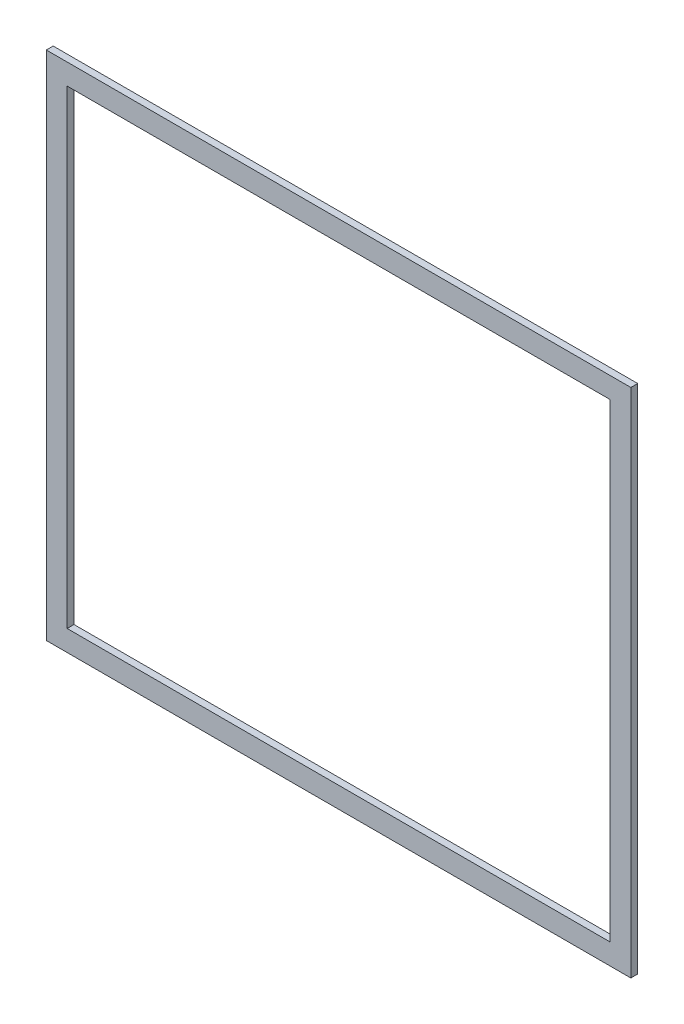
ISO-10303-21;
HEADER;
FILE_DESCRIPTION(('STEP AP214'),'2;1');
FILE_NAME('part.step','',(''),(''),'','','');
FILE_SCHEMA(('AUTOMOTIVE_DESIGN { 1 0 10303 214 1 1 1 1 }'));
ENDSEC;
DATA;
#1=APPLICATION_CONTEXT('core data for automotive mechanical design processes');
#2=APPLICATION_PROTOCOL_DEFINITION('international standard','automotive_design',2000,#1);
#3=PRODUCT_CONTEXT('',#1,'mechanical');
#4=PRODUCT('Part','Part','',(#3));
#5=PRODUCT_RELATED_PRODUCT_CATEGORY('part','',(#4));
#6=PRODUCT_DEFINITION_FORMATION('','',#4);
#7=PRODUCT_DEFINITION_CONTEXT('part definition',#1,'design');
#8=PRODUCT_DEFINITION('design','',#6,#7);
#9=PRODUCT_DEFINITION_SHAPE('','',#8);
#10=(LENGTH_UNIT() NAMED_UNIT(*) SI_UNIT(.MILLI.,.METRE.));
#11=(NAMED_UNIT(*) PLANE_ANGLE_UNIT() SI_UNIT($,.RADIAN.));
#12=(NAMED_UNIT(*) SI_UNIT($,.STERADIAN.) SOLID_ANGLE_UNIT());
#13=UNCERTAINTY_MEASURE_WITH_UNIT(LENGTH_MEASURE(1.E-05),#10,'distance_accuracy_value','');
#14=(GEOMETRIC_REPRESENTATION_CONTEXT(3) GLOBAL_UNCERTAINTY_ASSIGNED_CONTEXT((#13)) GLOBAL_UNIT_ASSIGNED_CONTEXT((#10,
#11,#12)) REPRESENTATION_CONTEXT('',''));
#15=CARTESIAN_POINT('',(0.,0.,0.));
#16=DIRECTION('',(0.,0.,1.));
#17=DIRECTION('',(1.,0.,0.));
#18=AXIS2_PLACEMENT_3D('',#15,#16,#17);
#19=CARTESIAN_POINT('',(94.2975,-81.5975,0.));
#20=DIRECTION('',(1.,0.,0.));
#21=DIRECTION('',(0.,1.,0.));
#22=AXIS2_PLACEMENT_3D('',#19,#20,#21);
#23=PLANE('',#22);
#24=DIRECTION('',(0.,0.,1.));
#25=VECTOR('',#24,1.);
#26=CARTESIAN_POINT('',(94.2975,81.5975000000001,0.));
#27=LINE('',#26,#25);
#28=CARTESIAN_POINT('',(94.2975,81.5975000000001,0.));
#29=VERTEX_POINT('',#28);
#30=CARTESIAN_POINT('',(94.2975,81.5975000000001,2.3876));
#31=VERTEX_POINT('',#30);
#32=EDGE_CURVE('E12',#29,#31,#27,.T.);
#33=ORIENTED_EDGE('',*,*,#32,.F.);
#34=DIRECTION('',(0.,1.,0.));
#35=VECTOR('',#34,1.);
#36=CARTESIAN_POINT('',(94.2975,-81.5975,0.));
#37=LINE('',#36,#35);
#38=CARTESIAN_POINT('',(94.2975,-81.5975,0.));
#39=VERTEX_POINT('',#38);
#40=EDGE_CURVE('E159',#39,#29,#37,.T.);
#41=ORIENTED_EDGE('',*,*,#40,.F.);
#42=DIRECTION('',(0.,0.,-1.));
#43=VECTOR('',#42,1.);
#44=CARTESIAN_POINT('',(94.2975,-81.5975,0.));
#45=LINE('',#44,#43);
#46=CARTESIAN_POINT('',(94.2975,-81.5975,2.3876));
#47=VERTEX_POINT('',#46);
#48=EDGE_CURVE('E169',#47,#39,#45,.T.);
#49=ORIENTED_EDGE('',*,*,#48,.F.);
#50=DIRECTION('',(0.,1.,0.));
#51=VECTOR('',#50,1.);
#52=CARTESIAN_POINT('',(94.2975,-81.5975,2.3876));
#53=LINE('',#52,#51);
#54=EDGE_CURVE('E153',#47,#31,#53,.T.);
#55=ORIENTED_EDGE('',*,*,#54,.T.);
#56=EDGE_LOOP('',(#33,#41,#49,#55));
#57=FACE_BOUND('',#56,.T.);
#58=ADVANCED_FACE('F40',(#57),#23,.F.);
#59=CARTESIAN_POINT('',(101.5365,-88.8365,2.3876));
#60=DIRECTION('',(-1.,0.,0.));
#61=DIRECTION('',(0.,-1.,0.));
#62=AXIS2_PLACEMENT_3D('',#59,#60,#61);
#63=PLANE('',#62);
#64=DIRECTION('',(0.,0.,-1.));
#65=VECTOR('',#64,1.);
#66=CARTESIAN_POINT('',(101.5365,88.8365,2.3876));
#67=LINE('',#66,#65);
#68=CARTESIAN_POINT('',(101.5365,88.8365000000001,2.3876));
#69=VERTEX_POINT('',#68);
#70=CARTESIAN_POINT('',(101.5365,88.8365,0.));
#71=VERTEX_POINT('',#70);
#72=EDGE_CURVE('E50',#69,#71,#67,.T.);
#73=ORIENTED_EDGE('',*,*,#72,.F.);
#74=DIRECTION('',(0.,1.,0.));
#75=VECTOR('',#74,1.);
#76=CARTESIAN_POINT('',(101.5365,-88.8365,2.3876));
#77=LINE('',#76,#75);
#78=CARTESIAN_POINT('',(101.5365,-88.8365,2.3876));
#79=VERTEX_POINT('',#78);
#80=EDGE_CURVE('E158',#79,#69,#77,.T.);
#81=ORIENTED_EDGE('',*,*,#80,.F.);
#82=DIRECTION('',(0.,0.,1.));
#83=VECTOR('',#82,1.);
#84=CARTESIAN_POINT('',(101.5365,-88.8365,2.3876));
#85=LINE('',#84,#83);
#86=CARTESIAN_POINT('',(101.5365,-88.8365,0.));
#87=VERTEX_POINT('',#86);
#88=EDGE_CURVE('E156',#87,#79,#85,.T.);
#89=ORIENTED_EDGE('',*,*,#88,.F.);
#90=DIRECTION('',(0.,1.,0.));
#91=VECTOR('',#90,1.);
#92=CARTESIAN_POINT('',(101.5365,-88.8365,0.));
#93=LINE('',#92,#91);
#94=EDGE_CURVE('E145',#87,#71,#93,.T.);
#95=ORIENTED_EDGE('',*,*,#94,.T.);
#96=EDGE_LOOP('',(#73,#81,#89,#95));
#97=FACE_BOUND('',#96,.T.);
#98=ADVANCED_FACE('F42',(#97),#63,.F.);
#99=CARTESIAN_POINT('',(-101.5365,-88.8365,2.3876));
#100=DIRECTION('',(0.,-1.,0.));
#101=DIRECTION('',(0.,0.,-1.));
#102=AXIS2_PLACEMENT_3D('',#99,#100,#101);
#103=PLANE('',#102);
#104=DIRECTION('',(1.,0.,0.));
#105=VECTOR('',#104,1.);
#106=CARTESIAN_POINT('',(-101.5365,-88.8365,0.));
#107=LINE('',#106,#105);
#108=CARTESIAN_POINT('',(-101.5365,-88.8365,0.));
#109=VERTEX_POINT('',#108);
#110=EDGE_CURVE('E179',#109,#87,#107,.T.);
#111=ORIENTED_EDGE('',*,*,#110,.T.);
#112=ORIENTED_EDGE('',*,*,#88,.T.);
#113=DIRECTION('',(1.,0.,0.));
#114=VECTOR('',#113,1.);
#115=CARTESIAN_POINT('',(-101.5365,-88.8365,2.3876));
#116=LINE('',#115,#114);
#117=CARTESIAN_POINT('',(-101.5365,-88.8365,2.3876));
#118=VERTEX_POINT('',#117);
#119=EDGE_CURVE('E175',#118,#79,#116,.T.);
#120=ORIENTED_EDGE('',*,*,#119,.F.);
#121=DIRECTION('',(0.,0.,-1.));
#122=VECTOR('',#121,1.);
#123=CARTESIAN_POINT('',(-101.5365,-88.8365,2.3876));
#124=LINE('',#123,#122);
#125=EDGE_CURVE('E184',#118,#109,#124,.T.);
#126=ORIENTED_EDGE('',*,*,#125,.T.);
#127=EDGE_LOOP('',(#111,#112,#120,#126));
#128=FACE_BOUND('',#127,.T.);
#129=ADVANCED_FACE('F193',(#128),#103,.T.);
#130=CARTESIAN_POINT('',(-94.2974999999999,-81.5975,0.));
#131=DIRECTION('',(0.,1.,0.));
#132=DIRECTION('',(0.,0.,1.));
#133=AXIS2_PLACEMENT_3D('',#130,#131,#132);
#134=PLANE('',#133);
#135=DIRECTION('',(1.,0.,0.));
#136=VECTOR('',#135,1.);
#137=CARTESIAN_POINT('',(-94.2974999999999,-81.5975,2.3876));
#138=LINE('',#137,#136);
#139=CARTESIAN_POINT('',(-94.2974999999999,-81.5975,2.3876));
#140=VERTEX_POINT('',#139);
#141=EDGE_CURVE('E111',#140,#47,#138,.T.);
#142=ORIENTED_EDGE('',*,*,#141,.T.);
#143=ORIENTED_EDGE('',*,*,#48,.T.);
#144=DIRECTION('',(1.,0.,0.));
#145=VECTOR('',#144,1.);
#146=CARTESIAN_POINT('',(-94.2974999999999,-81.5975,0.));
#147=LINE('',#146,#145);
#148=CARTESIAN_POINT('',(-94.2974999999999,-81.5975,0.));
#149=VERTEX_POINT('',#148);
#150=EDGE_CURVE('E172',#149,#39,#147,.T.);
#151=ORIENTED_EDGE('',*,*,#150,.F.);
#152=DIRECTION('',(0.,0.,1.));
#153=VECTOR('',#152,1.);
#154=CARTESIAN_POINT('',(-94.2974999999999,-81.5975,0.));
#155=LINE('',#154,#153);
#156=EDGE_CURVE('E174',#149,#140,#155,.T.);
#157=ORIENTED_EDGE('',*,*,#156,.T.);
#158=EDGE_LOOP('',(#142,#143,#151,#157));
#159=FACE_BOUND('',#158,.T.);
#160=ADVANCED_FACE('F173',(#159),#134,.T.);
#161=CARTESIAN_POINT('',(-101.5365,88.8365,2.3876));
#162=DIRECTION('',(1.,0.,0.));
#163=DIRECTION('',(0.,1.,0.));
#164=AXIS2_PLACEMENT_3D('',#161,#162,#163);
#165=PLANE('',#164);
#166=ORIENTED_EDGE('',*,*,#125,.F.);
#167=DIRECTION('',(0.,-1.,0.));
#168=VECTOR('',#167,1.);
#169=CARTESIAN_POINT('',(-101.5365,88.8365,2.3876));
#170=LINE('',#169,#168);
#171=CARTESIAN_POINT('',(-101.5365,88.8365,2.3876));
#172=VERTEX_POINT('',#171);
#173=EDGE_CURVE('E116',#172,#118,#170,.T.);
#174=ORIENTED_EDGE('',*,*,#173,.F.);
#175=DIRECTION('',(0.,0.,1.));
#176=VECTOR('',#175,1.);
#177=CARTESIAN_POINT('',(-101.5365,88.8365,2.3876));
#178=LINE('',#177,#176);
#179=CARTESIAN_POINT('',(-101.5365,88.8365,0.));
#180=VERTEX_POINT('',#179);
#181=EDGE_CURVE('E124',#180,#172,#178,.T.);
#182=ORIENTED_EDGE('',*,*,#181,.F.);
#183=DIRECTION('',(0.,-1.,0.));
#184=VECTOR('',#183,1.);
#185=CARTESIAN_POINT('',(-101.5365,88.8365,0.));
#186=LINE('',#185,#184);
#187=EDGE_CURVE('E148',#180,#109,#186,.T.);
#188=ORIENTED_EDGE('',*,*,#187,.T.);
#189=EDGE_LOOP('',(#166,#174,#182,#188));
#190=FACE_BOUND('',#189,.T.);
#191=ADVANCED_FACE('F196',(#190),#165,.F.);
#192=CARTESIAN_POINT('',(-94.2975,81.5975,0.));
#193=DIRECTION('',(-1.,0.,0.));
#194=DIRECTION('',(0.,-1.,0.));
#195=AXIS2_PLACEMENT_3D('',#192,#193,#194);
#196=PLANE('',#195);
#197=ORIENTED_EDGE('',*,*,#156,.F.);
#198=DIRECTION('',(0.,-1.,0.));
#199=VECTOR('',#198,1.);
#200=CARTESIAN_POINT('',(-94.2975,81.5975,0.));
#201=LINE('',#200,#199);
#202=CARTESIAN_POINT('',(-94.2975,81.5975,0.));
#203=VERTEX_POINT('',#202);
#204=EDGE_CURVE('E115',#203,#149,#201,.T.);
#205=ORIENTED_EDGE('',*,*,#204,.F.);
#206=DIRECTION('',(0.,0.,-1.));
#207=VECTOR('',#206,1.);
#208=CARTESIAN_POINT('',(-94.2975,81.5975,0.));
#209=LINE('',#208,#207);
#210=CARTESIAN_POINT('',(-94.2975,81.5975,2.3876));
#211=VERTEX_POINT('',#210);
#212=EDGE_CURVE('E119',#211,#203,#209,.T.);
#213=ORIENTED_EDGE('',*,*,#212,.F.);
#214=DIRECTION('',(0.,-1.,0.));
#215=VECTOR('',#214,1.);
#216=CARTESIAN_POINT('',(-94.2975,81.5975,2.3876));
#217=LINE('',#216,#215);
#218=EDGE_CURVE('E104',#211,#140,#217,.T.);
#219=ORIENTED_EDGE('',*,*,#218,.T.);
#220=EDGE_LOOP('',(#197,#205,#213,#219));
#221=FACE_BOUND('',#220,.T.);
#222=ADVANCED_FACE('F120',(#221),#196,.F.);
#223=CARTESIAN_POINT('',(-113.162163791839,81.5975,2.3876));
#224=DIRECTION('',(0.,0.,1.));
#225=DIRECTION('',(0.,-1.,0.));
#226=AXIS2_PLACEMENT_3D('',#223,#224,#225);
#227=PLANE('',#226);
#228=ORIENTED_EDGE('',*,*,#218,.F.);
#229=DIRECTION('',(1.,0.,0.));
#230=VECTOR('',#229,1.);
#231=CARTESIAN_POINT('',(-113.162163791839,81.5975,2.3876));
#232=LINE('',#231,#230);
#233=EDGE_CURVE('E109',#211,#31,#232,.T.);
#234=ORIENTED_EDGE('',*,*,#233,.T.);
#235=ORIENTED_EDGE('',*,*,#54,.F.);
#236=ORIENTED_EDGE('',*,*,#141,.F.);
#237=EDGE_LOOP('',(#228,#234,#235,#236));
#238=FACE_BOUND('',#237,.T.);
#239=DIRECTION('',(1.,0.,0.));
#240=VECTOR('',#239,1.);
#241=CARTESIAN_POINT('',(-113.162163791839,88.8365,2.3876));
#242=LINE('',#241,#240);
#243=EDGE_CURVE('E57',#172,#69,#242,.T.);
#244=ORIENTED_EDGE('',*,*,#243,.F.);
#245=ORIENTED_EDGE('',*,*,#173,.T.);
#246=ORIENTED_EDGE('',*,*,#119,.T.);
#247=ORIENTED_EDGE('',*,*,#80,.T.);
#248=EDGE_LOOP('',(#244,#245,#246,#247));
#249=FACE_BOUND('',#248,.T.);
#250=ADVANCED_FACE('F106',(#238,#249),#227,.T.);
#251=CARTESIAN_POINT('',(-113.162163791839,81.5975,0.));
#252=DIRECTION('',(0.,-1.,0.));
#253=DIRECTION('',(0.,0.,-1.));
#254=AXIS2_PLACEMENT_3D('',#251,#252,#253);
#255=PLANE('',#254);
#256=ORIENTED_EDGE('',*,*,#233,.F.);
#257=ORIENTED_EDGE('',*,*,#212,.T.);
#258=DIRECTION('',(1.,0.,0.));
#259=VECTOR('',#258,1.);
#260=CARTESIAN_POINT('',(-113.162163791839,81.5975,0.));
#261=LINE('',#260,#259);
#262=EDGE_CURVE('E130',#203,#29,#261,.T.);
#263=ORIENTED_EDGE('',*,*,#262,.T.);
#264=ORIENTED_EDGE('',*,*,#32,.T.);
#265=EDGE_LOOP('',(#256,#257,#263,#264));
#266=FACE_BOUND('',#265,.T.);
#267=ADVANCED_FACE('F127',(#266),#255,.T.);
#268=CARTESIAN_POINT('',(-113.162163791839,88.8365,0.));
#269=DIRECTION('',(0.,0.,-1.));
#270=DIRECTION('',(0.,1.,0.));
#271=AXIS2_PLACEMENT_3D('',#268,#269,#270);
#272=PLANE('',#271);
#273=ORIENTED_EDGE('',*,*,#187,.F.);
#274=DIRECTION('',(1.,0.,0.));
#275=VECTOR('',#274,1.);
#276=CARTESIAN_POINT('',(-113.162163791839,88.8365,0.));
#277=LINE('',#276,#275);
#278=EDGE_CURVE('E125',#180,#71,#277,.T.);
#279=ORIENTED_EDGE('',*,*,#278,.T.);
#280=ORIENTED_EDGE('',*,*,#94,.F.);
#281=ORIENTED_EDGE('',*,*,#110,.F.);
#282=EDGE_LOOP('',(#273,#279,#280,#281));
#283=FACE_BOUND('',#282,.T.);
#284=ORIENTED_EDGE('',*,*,#262,.F.);
#285=ORIENTED_EDGE('',*,*,#204,.T.);
#286=ORIENTED_EDGE('',*,*,#150,.T.);
#287=ORIENTED_EDGE('',*,*,#40,.T.);
#288=EDGE_LOOP('',(#284,#285,#286,#287));
#289=FACE_BOUND('',#288,.T.);
#290=ADVANCED_FACE('F142',(#283,#289),#272,.T.);
#291=CARTESIAN_POINT('',(-113.162163791839,88.8365,2.3876));
#292=DIRECTION('',(0.,1.,0.));
#293=DIRECTION('',(0.,0.,1.));
#294=AXIS2_PLACEMENT_3D('',#291,#292,#293);
#295=PLANE('',#294);
#296=ORIENTED_EDGE('',*,*,#278,.F.);
#297=ORIENTED_EDGE('',*,*,#181,.T.);
#298=ORIENTED_EDGE('',*,*,#243,.T.);
#299=ORIENTED_EDGE('',*,*,#72,.T.);
#300=EDGE_LOOP('',(#296,#297,#298,#299));
#301=FACE_BOUND('',#300,.T.);
#302=ADVANCED_FACE('F150',(#301),#295,.T.);
#303=CLOSED_SHELL('',(#58,#98,#129,#160,#191,#222,#250,#267,#290,#302));
#304=MANIFOLD_SOLID_BREP('B2',#303);
#305=ADVANCED_BREP_SHAPE_REPRESENTATION('',(#18,#304),#14);
#306=SHAPE_DEFINITION_REPRESENTATION(#9,#305);
ENDSEC;
END-ISO-10303-21;
